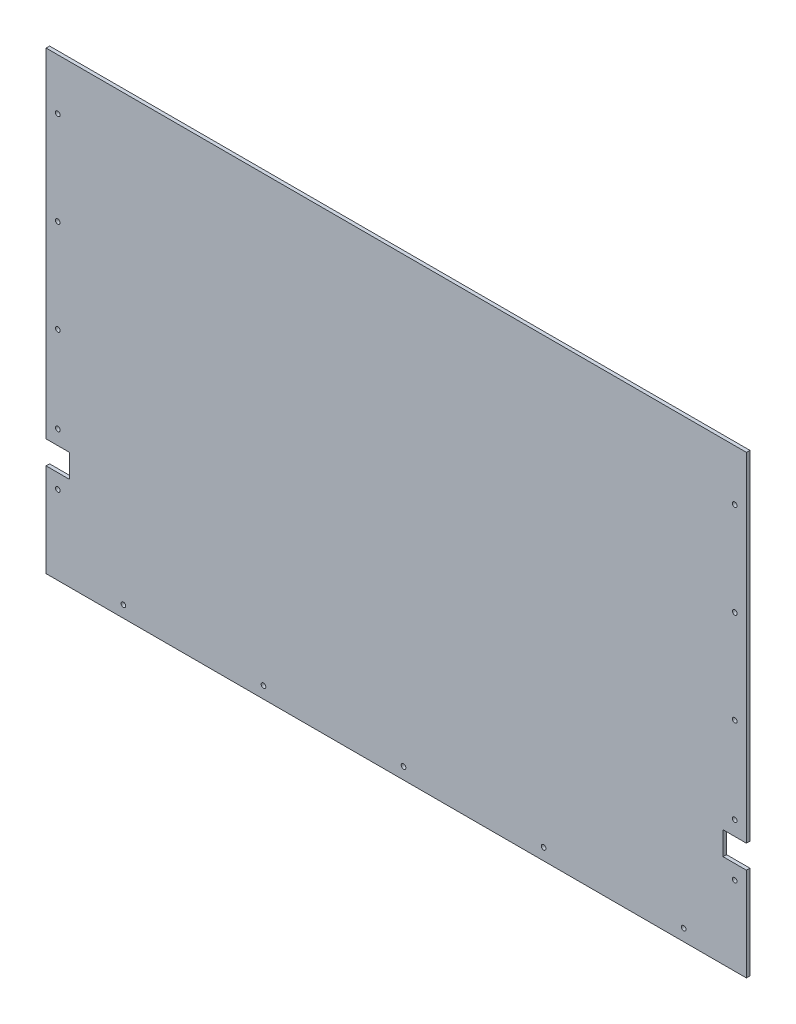
ISO-10303-21;
HEADER;
FILE_DESCRIPTION(('STEP AP214'),'2;1');
FILE_NAME('part.step','',(''),(''),'','','');
FILE_SCHEMA(('AUTOMOTIVE_DESIGN { 1 0 10303 214 1 1 1 1 }'));
ENDSEC;
DATA;
#1=APPLICATION_CONTEXT('core data for automotive mechanical design processes');
#2=APPLICATION_PROTOCOL_DEFINITION('international standard','automotive_design',2000,#1);
#3=PRODUCT_CONTEXT('',#1,'mechanical');
#4=PRODUCT('Part','Part','',(#3));
#5=PRODUCT_RELATED_PRODUCT_CATEGORY('part','',(#4));
#6=PRODUCT_DEFINITION_FORMATION('','',#4);
#7=PRODUCT_DEFINITION_CONTEXT('part definition',#1,'design');
#8=PRODUCT_DEFINITION('design','',#6,#7);
#9=PRODUCT_DEFINITION_SHAPE('','',#8);
#10=(LENGTH_UNIT() NAMED_UNIT(*) SI_UNIT(.MILLI.,.METRE.));
#11=(NAMED_UNIT(*) PLANE_ANGLE_UNIT() SI_UNIT($,.RADIAN.));
#12=(NAMED_UNIT(*) SI_UNIT($,.STERADIAN.) SOLID_ANGLE_UNIT());
#13=UNCERTAINTY_MEASURE_WITH_UNIT(LENGTH_MEASURE(1.E-05),#10,'distance_accuracy_value','');
#14=(GEOMETRIC_REPRESENTATION_CONTEXT(3) GLOBAL_UNCERTAINTY_ASSIGNED_CONTEXT((#13)) GLOBAL_UNIT_ASSIGNED_CONTEXT((#10,
#11,#12)) REPRESENTATION_CONTEXT('',''));
#15=CARTESIAN_POINT('',(0.,0.,0.));
#16=DIRECTION('',(0.,0.,1.));
#17=DIRECTION('',(1.,0.,0.));
#18=AXIS2_PLACEMENT_3D('',#15,#16,#17);
#19=CARTESIAN_POINT('',(0.,0.,3.));
#20=DIRECTION('',(1.,0.,0.));
#21=DIRECTION('',(0.,0.,-1.));
#22=AXIS2_PLACEMENT_3D('',#19,#20,#21);
#23=PLANE('',#22);
#24=DIRECTION('',(0.,-1.,0.));
#25=VECTOR('',#24,1.);
#26=CARTESIAN_POINT('',(0.,0.,0.));
#27=LINE('',#26,#25);
#28=CARTESIAN_POINT('',(0.,390.,0.));
#29=VERTEX_POINT('',#28);
#30=CARTESIAN_POINT('',(0.,100.,0.));
#31=VERTEX_POINT('',#30);
#32=EDGE_CURVE('E153',#29,#31,#27,.T.);
#33=ORIENTED_EDGE('',*,*,#32,.T.);
#34=DIRECTION('',(0.,0.,1.));
#35=VECTOR('',#34,1.);
#36=CARTESIAN_POINT('',(0.,100.,0.));
#37=LINE('',#36,#35);
#38=CARTESIAN_POINT('',(0.,100.,3.));
#39=VERTEX_POINT('',#38);
#40=EDGE_CURVE('E185',#31,#39,#37,.T.);
#41=ORIENTED_EDGE('',*,*,#40,.T.);
#42=DIRECTION('',(0.,-1.,0.));
#43=VECTOR('',#42,1.);
#44=CARTESIAN_POINT('',(0.,0.,3.));
#45=LINE('',#44,#43);
#46=CARTESIAN_POINT('',(0.,390.,3.));
#47=VERTEX_POINT('',#46);
#48=EDGE_CURVE('E219',#47,#39,#45,.T.);
#49=ORIENTED_EDGE('',*,*,#48,.F.);
#50=DIRECTION('',(0.,0.,-1.));
#51=VECTOR('',#50,1.);
#52=CARTESIAN_POINT('',(0.,390.,3.));
#53=LINE('',#52,#51);
#54=EDGE_CURVE('E159',#47,#29,#53,.T.);
#55=ORIENTED_EDGE('',*,*,#54,.T.);
#56=EDGE_LOOP('',(#33,#41,#49,#55));
#57=FACE_BOUND('',#56,.T.);
#58=ADVANCED_FACE('F36',(#57),#23,.F.);
#59=CARTESIAN_POINT('',(600.,0.,3.));
#60=DIRECTION('',(-1.,0.,0.));
#61=DIRECTION('',(0.,0.,1.));
#62=AXIS2_PLACEMENT_3D('',#59,#60,#61);
#63=PLANE('',#62);
#64=DIRECTION('',(0.,1.,0.));
#65=VECTOR('',#64,1.);
#66=CARTESIAN_POINT('',(600.,0.,0.));
#67=LINE('',#66,#65);
#68=CARTESIAN_POINT('',(600.,0.,0.));
#69=VERTEX_POINT('',#68);
#70=CARTESIAN_POINT('',(600.,80.,0.));
#71=VERTEX_POINT('',#70);
#72=EDGE_CURVE('E149',#69,#71,#67,.T.);
#73=ORIENTED_EDGE('',*,*,#72,.T.);
#74=DIRECTION('',(0.,0.,1.));
#75=VECTOR('',#74,1.);
#76=CARTESIAN_POINT('',(600.,80.,0.));
#77=LINE('',#76,#75);
#78=CARTESIAN_POINT('',(600.,80.,3.));
#79=VERTEX_POINT('',#78);
#80=EDGE_CURVE('E189',#71,#79,#77,.T.);
#81=ORIENTED_EDGE('',*,*,#80,.T.);
#82=DIRECTION('',(0.,1.,0.));
#83=VECTOR('',#82,1.);
#84=CARTESIAN_POINT('',(600.,0.,3.));
#85=LINE('',#84,#83);
#86=CARTESIAN_POINT('',(600.,0.,3.));
#87=VERTEX_POINT('',#86);
#88=EDGE_CURVE('E172',#87,#79,#85,.T.);
#89=ORIENTED_EDGE('',*,*,#88,.F.);
#90=DIRECTION('',(0.,0.,-1.));
#91=VECTOR('',#90,1.);
#92=CARTESIAN_POINT('',(600.,0.,3.));
#93=LINE('',#92,#91);
#94=EDGE_CURVE('E44',#87,#69,#93,.T.);
#95=ORIENTED_EDGE('',*,*,#94,.T.);
#96=EDGE_LOOP('',(#73,#81,#89,#95));
#97=FACE_BOUND('',#96,.T.);
#98=ADVANCED_FACE('F169',(#97),#63,.F.);
#99=CARTESIAN_POINT('',(0.,80.,3.));
#100=VERTEX_POINT('',#99);
#101=CARTESIAN_POINT('',(0.,0.,3.));
#102=VERTEX_POINT('',#101);
#103=EDGE_CURVE('E158',#100,#102,#45,.T.);
#104=ORIENTED_EDGE('',*,*,#103,.F.);
#105=DIRECTION('',(0.,0.,1.));
#106=VECTOR('',#105,1.);
#107=CARTESIAN_POINT('',(0.,80.,0.));
#108=LINE('',#107,#106);
#109=CARTESIAN_POINT('',(0.,80.,0.));
#110=VERTEX_POINT('',#109);
#111=EDGE_CURVE('E203',#110,#100,#108,.T.);
#112=ORIENTED_EDGE('',*,*,#111,.F.);
#113=CARTESIAN_POINT('',(0.,0.,0.));
#114=VERTEX_POINT('',#113);
#115=EDGE_CURVE('E191',#110,#114,#27,.T.);
#116=ORIENTED_EDGE('',*,*,#115,.T.);
#117=DIRECTION('',(0.,0.,-1.));
#118=VECTOR('',#117,1.);
#119=CARTESIAN_POINT('',(0.,0.,3.));
#120=LINE('',#119,#118);
#121=EDGE_CURVE('E11',#102,#114,#120,.T.);
#122=ORIENTED_EDGE('',*,*,#121,.F.);
#123=EDGE_LOOP('',(#104,#112,#116,#122));
#124=FACE_BOUND('',#123,.T.);
#125=ADVANCED_FACE('F38',(#124),#23,.F.);
#126=CARTESIAN_POINT('',(0.,0.,3.));
#127=DIRECTION('',(0.,1.,0.));
#128=DIRECTION('',(0.,0.,1.));
#129=AXIS2_PLACEMENT_3D('',#126,#127,#128);
#130=PLANE('',#129);
#131=DIRECTION('',(1.,0.,0.));
#132=VECTOR('',#131,1.);
#133=CARTESIAN_POINT('',(0.,0.,0.));
#134=LINE('',#133,#132);
#135=EDGE_CURVE('E150',#114,#69,#134,.T.);
#136=ORIENTED_EDGE('',*,*,#135,.T.);
#137=ORIENTED_EDGE('',*,*,#94,.F.);
#138=DIRECTION('',(1.,0.,0.));
#139=VECTOR('',#138,1.);
#140=CARTESIAN_POINT('',(0.,0.,3.));
#141=LINE('',#140,#139);
#142=EDGE_CURVE('E222',#102,#87,#141,.T.);
#143=ORIENTED_EDGE('',*,*,#142,.F.);
#144=ORIENTED_EDGE('',*,*,#121,.T.);
#145=EDGE_LOOP('',(#136,#137,#143,#144));
#146=FACE_BOUND('',#145,.T.);
#147=ADVANCED_FACE('F251',(#146),#130,.F.);
#148=CARTESIAN_POINT('',(600.,100.,3.));
#149=VERTEX_POINT('',#148);
#150=CARTESIAN_POINT('',(600.,390.,3.));
#151=VERTEX_POINT('',#150);
#152=EDGE_CURVE('E141',#149,#151,#85,.T.);
#153=ORIENTED_EDGE('',*,*,#152,.F.);
#154=DIRECTION('',(0.,0.,1.));
#155=VECTOR('',#154,1.);
#156=CARTESIAN_POINT('',(600.,100.,0.));
#157=LINE('',#156,#155);
#158=CARTESIAN_POINT('',(600.,100.,0.));
#159=VERTEX_POINT('',#158);
#160=EDGE_CURVE('E128',#159,#149,#157,.T.);
#161=ORIENTED_EDGE('',*,*,#160,.F.);
#162=CARTESIAN_POINT('',(600.,390.,0.));
#163=VERTEX_POINT('',#162);
#164=EDGE_CURVE('E139',#159,#163,#67,.T.);
#165=ORIENTED_EDGE('',*,*,#164,.T.);
#166=DIRECTION('',(0.,0.,-1.));
#167=VECTOR('',#166,1.);
#168=CARTESIAN_POINT('',(600.,390.,3.));
#169=LINE('',#168,#167);
#170=EDGE_CURVE('E162',#151,#163,#169,.T.);
#171=ORIENTED_EDGE('',*,*,#170,.F.);
#172=EDGE_LOOP('',(#153,#161,#165,#171));
#173=FACE_BOUND('',#172,.T.);
#174=ADVANCED_FACE('F137',(#173),#63,.F.);
#175=CARTESIAN_POINT('',(0.,390.,3.));
#176=DIRECTION('',(0.,-1.,0.));
#177=DIRECTION('',(0.,0.,-1.));
#178=AXIS2_PLACEMENT_3D('',#175,#176,#177);
#179=PLANE('',#178);
#180=DIRECTION('',(-1.,0.,0.));
#181=VECTOR('',#180,1.);
#182=CARTESIAN_POINT('',(0.,390.,0.));
#183=LINE('',#182,#181);
#184=EDGE_CURVE('E148',#163,#29,#183,.T.);
#185=ORIENTED_EDGE('',*,*,#184,.T.);
#186=ORIENTED_EDGE('',*,*,#54,.F.);
#187=DIRECTION('',(-1.,0.,0.));
#188=VECTOR('',#187,1.);
#189=CARTESIAN_POINT('',(0.,390.,3.));
#190=LINE('',#189,#188);
#191=EDGE_CURVE('E163',#151,#47,#190,.T.);
#192=ORIENTED_EDGE('',*,*,#191,.F.);
#193=ORIENTED_EDGE('',*,*,#170,.T.);
#194=EDGE_LOOP('',(#185,#186,#192,#193));
#195=FACE_BOUND('',#194,.T.);
#196=ADVANCED_FACE('F246',(#195),#179,.F.);
#197=CARTESIAN_POINT('',(0.,0.,3.));
#198=DIRECTION('',(0.,0.,-1.));
#199=DIRECTION('',(-1.,0.,0.));
#200=AXIS2_PLACEMENT_3D('',#197,#198,#199);
#201=PLANE('',#200);
#202=CARTESIAN_POINT('',(590.,346.25,3.));
#203=DIRECTION('',(0.,0.,-1.));
#204=DIRECTION('',(-1.,0.,0.));
#205=AXIS2_PLACEMENT_3D('',#202,#203,#204);
#206=CIRCLE('',#205,2.);
#207=CARTESIAN_POINT('',(588.,346.25,3.));
#208=VERTEX_POINT('',#207);
#209=EDGE_CURVE('E349',#208,#208,#206,.T.);
#210=ORIENTED_EDGE('',*,*,#209,.T.);
#211=EDGE_LOOP('',(#210));
#212=FACE_BOUND('',#211,.T.);
#213=CARTESIAN_POINT('',(10.,346.25,3.));
#214=DIRECTION('',(0.,0.,-1.));
#215=DIRECTION('',(-1.,0.,0.));
#216=AXIS2_PLACEMENT_3D('',#213,#214,#215);
#217=CIRCLE('',#216,2.);
#218=CARTESIAN_POINT('',(8.00000000000001,346.25,3.));
#219=VERTEX_POINT('',#218);
#220=EDGE_CURVE('E359',#219,#219,#217,.T.);
#221=ORIENTED_EDGE('',*,*,#220,.T.);
#222=EDGE_LOOP('',(#221));
#223=FACE_BOUND('',#222,.T.);
#224=CARTESIAN_POINT('',(9.99999999999912,266.25,3.));
#225=DIRECTION('',(0.,0.,-1.));
#226=DIRECTION('',(-1.,0.,0.));
#227=AXIS2_PLACEMENT_3D('',#224,#225,#226);
#228=CIRCLE('',#227,2.);
#229=CARTESIAN_POINT('',(7.99999999999912,266.25,3.));
#230=VERTEX_POINT('',#229);
#231=EDGE_CURVE('E365',#230,#230,#228,.T.);
#232=ORIENTED_EDGE('',*,*,#231,.T.);
#233=EDGE_LOOP('',(#232));
#234=FACE_BOUND('',#233,.T.);
#235=CARTESIAN_POINT('',(9.99999999999834,186.25,3.));
#236=DIRECTION('',(0.,0.,-1.));
#237=DIRECTION('',(-1.,0.,0.));
#238=AXIS2_PLACEMENT_3D('',#235,#236,#237);
#239=CIRCLE('',#238,2.);
#240=CARTESIAN_POINT('',(7.99999999999835,186.25,3.));
#241=VERTEX_POINT('',#240);
#242=EDGE_CURVE('E371',#241,#241,#239,.T.);
#243=ORIENTED_EDGE('',*,*,#242,.T.);
#244=EDGE_LOOP('',(#243));
#245=FACE_BOUND('',#244,.T.);
#246=CARTESIAN_POINT('',(589.999999999999,266.25,3.));
#247=DIRECTION('',(0.,0.,-1.));
#248=DIRECTION('',(-1.,0.,0.));
#249=AXIS2_PLACEMENT_3D('',#246,#247,#248);
#250=CIRCLE('',#249,2.);
#251=CARTESIAN_POINT('',(587.999999999999,266.25,3.));
#252=VERTEX_POINT('',#251);
#253=EDGE_CURVE('E377',#252,#252,#250,.T.);
#254=ORIENTED_EDGE('',*,*,#253,.T.);
#255=EDGE_LOOP('',(#254));
#256=FACE_BOUND('',#255,.T.);
#257=CARTESIAN_POINT('',(589.999999999998,186.25,3.));
#258=DIRECTION('',(0.,0.,-1.));
#259=DIRECTION('',(-1.,0.,0.));
#260=AXIS2_PLACEMENT_3D('',#257,#258,#259);
#261=CIRCLE('',#260,2.);
#262=CARTESIAN_POINT('',(587.999999999998,186.25,3.));
#263=VERTEX_POINT('',#262);
#264=EDGE_CURVE('E383',#263,#263,#261,.T.);
#265=ORIENTED_EDGE('',*,*,#264,.T.);
#266=EDGE_LOOP('',(#265));
#267=FACE_BOUND('',#266,.T.);
#268=CARTESIAN_POINT('',(589.999999999986,112.449594156221,3.));
#269=DIRECTION('',(0.,0.,-1.));
#270=DIRECTION('',(-1.,0.,0.));
#271=AXIS2_PLACEMENT_3D('',#268,#269,#270);
#272=CIRCLE('',#271,2.);
#273=CARTESIAN_POINT('',(587.999999999986,112.449594156221,3.));
#274=VERTEX_POINT('',#273);
#275=EDGE_CURVE('E389',#274,#274,#272,.T.);
#276=ORIENTED_EDGE('',*,*,#275,.T.);
#277=EDGE_LOOP('',(#276));
#278=FACE_BOUND('',#277,.T.);
#279=CARTESIAN_POINT('',(589.999999999985,67.5504058437759,3.));
#280=DIRECTION('',(0.,0.,-1.));
#281=DIRECTION('',(-1.,0.,0.));
#282=AXIS2_PLACEMENT_3D('',#279,#280,#281);
#283=CIRCLE('',#282,2.);
#284=CARTESIAN_POINT('',(587.999999999985,67.5504058437759,3.));
#285=VERTEX_POINT('',#284);
#286=EDGE_CURVE('E395',#285,#285,#283,.T.);
#287=ORIENTED_EDGE('',*,*,#286,.T.);
#288=EDGE_LOOP('',(#287));
#289=FACE_BOUND('',#288,.T.);
#290=CARTESIAN_POINT('',(9.99999999999631,112.449594156213,3.));
#291=DIRECTION('',(0.,0.,-1.));
#292=DIRECTION('',(-1.,0.,0.));
#293=AXIS2_PLACEMENT_3D('',#290,#291,#292);
#294=CIRCLE('',#293,2.);
#295=CARTESIAN_POINT('',(7.99999999999632,112.449594156213,3.));
#296=VERTEX_POINT('',#295);
#297=EDGE_CURVE('E401',#296,#296,#294,.T.);
#298=ORIENTED_EDGE('',*,*,#297,.T.);
#299=EDGE_LOOP('',(#298));
#300=FACE_BOUND('',#299,.T.);
#301=CARTESIAN_POINT('',(10.0000000000045,67.5504058437766,3.));
#302=DIRECTION('',(0.,0.,-1.));
#303=DIRECTION('',(-1.,0.,0.));
#304=AXIS2_PLACEMENT_3D('',#301,#302,#303);
#305=CIRCLE('',#304,2.);
#306=CARTESIAN_POINT('',(8.00000000000447,67.5504058437766,3.));
#307=VERTEX_POINT('',#306);
#308=EDGE_CURVE('E407',#307,#307,#305,.T.);
#309=ORIENTED_EDGE('',*,*,#308,.T.);
#310=EDGE_LOOP('',(#309));
#311=FACE_BOUND('',#310,.T.);
#312=CARTESIAN_POINT('',(66.250000000002,10.0691053708772,3.));
#313=DIRECTION('',(0.,0.,-1.));
#314=DIRECTION('',(-1.,0.,0.));
#315=AXIS2_PLACEMENT_3D('',#312,#313,#314);
#316=CIRCLE('',#315,2.);
#317=CARTESIAN_POINT('',(64.250000000002,10.0691053708772,3.));
#318=VERTEX_POINT('',#317);
#319=EDGE_CURVE('E413',#318,#318,#316,.T.);
#320=ORIENTED_EDGE('',*,*,#319,.T.);
#321=EDGE_LOOP('',(#320));
#322=FACE_BOUND('',#321,.T.);
#323=CARTESIAN_POINT('',(186.250000000002,10.0691053708773,3.));
#324=DIRECTION('',(0.,0.,-1.));
#325=DIRECTION('',(-1.,0.,0.));
#326=AXIS2_PLACEMENT_3D('',#323,#324,#325);
#327=CIRCLE('',#326,2.);
#328=CARTESIAN_POINT('',(184.250000000002,10.0691053708773,3.));
#329=VERTEX_POINT('',#328);
#330=EDGE_CURVE('E419',#329,#329,#327,.T.);
#331=ORIENTED_EDGE('',*,*,#330,.T.);
#332=EDGE_LOOP('',(#331));
#333=FACE_BOUND('',#332,.T.);
#334=CARTESIAN_POINT('',(306.250000000002,10.0691053708774,3.));
#335=DIRECTION('',(0.,0.,-1.));
#336=DIRECTION('',(-1.,0.,0.));
#337=AXIS2_PLACEMENT_3D('',#334,#335,#336);
#338=CIRCLE('',#337,2.);
#339=CARTESIAN_POINT('',(304.250000000002,10.0691053708774,3.));
#340=VERTEX_POINT('',#339);
#341=EDGE_CURVE('E425',#340,#340,#338,.T.);
#342=ORIENTED_EDGE('',*,*,#341,.T.);
#343=EDGE_LOOP('',(#342));
#344=FACE_BOUND('',#343,.T.);
#345=CARTESIAN_POINT('',(426.250000000002,10.0691053708775,3.));
#346=DIRECTION('',(0.,0.,-1.));
#347=DIRECTION('',(-1.,0.,0.));
#348=AXIS2_PLACEMENT_3D('',#345,#346,#347);
#349=CIRCLE('',#348,2.);
#350=CARTESIAN_POINT('',(424.250000000002,10.0691053708775,3.));
#351=VERTEX_POINT('',#350);
#352=EDGE_CURVE('E431',#351,#351,#349,.T.);
#353=ORIENTED_EDGE('',*,*,#352,.T.);
#354=EDGE_LOOP('',(#353));
#355=FACE_BOUND('',#354,.T.);
#356=CARTESIAN_POINT('',(546.250000000002,10.0691053708775,3.));
#357=DIRECTION('',(0.,0.,-1.));
#358=DIRECTION('',(-1.,0.,0.));
#359=AXIS2_PLACEMENT_3D('',#356,#357,#358);
#360=CIRCLE('',#359,2.);
#361=CARTESIAN_POINT('',(544.250000000002,10.0691053708775,3.));
#362=VERTEX_POINT('',#361);
#363=EDGE_CURVE('E208',#362,#362,#360,.T.);
#364=ORIENTED_EDGE('',*,*,#363,.T.);
#365=EDGE_LOOP('',(#364));
#366=FACE_BOUND('',#365,.T.);
#367=ORIENTED_EDGE('',*,*,#88,.T.);
#368=DIRECTION('',(1.,0.,0.));
#369=VECTOR('',#368,1.);
#370=CARTESIAN_POINT('',(600.,80.,3.));
#371=LINE('',#370,#369);
#372=CARTESIAN_POINT('',(580.,80.,3.));
#373=VERTEX_POINT('',#372);
#374=EDGE_CURVE('E133',#373,#79,#371,.T.);
#375=ORIENTED_EDGE('',*,*,#374,.F.);
#376=DIRECTION('',(0.,-1.,0.));
#377=VECTOR('',#376,1.);
#378=CARTESIAN_POINT('',(580.,100.,3.));
#379=LINE('',#378,#377);
#380=CARTESIAN_POINT('',(580.,100.,3.));
#381=VERTEX_POINT('',#380);
#382=EDGE_CURVE('E184',#381,#373,#379,.T.);
#383=ORIENTED_EDGE('',*,*,#382,.F.);
#384=DIRECTION('',(-1.,0.,0.));
#385=VECTOR('',#384,1.);
#386=CARTESIAN_POINT('',(600.,100.,3.));
#387=LINE('',#386,#385);
#388=EDGE_CURVE('E182',#149,#381,#387,.T.);
#389=ORIENTED_EDGE('',*,*,#388,.F.);
#390=ORIENTED_EDGE('',*,*,#152,.T.);
#391=ORIENTED_EDGE('',*,*,#191,.T.);
#392=ORIENTED_EDGE('',*,*,#48,.T.);
#393=DIRECTION('',(-1.,0.,0.));
#394=VECTOR('',#393,1.);
#395=CARTESIAN_POINT('',(0.,100.,3.));
#396=LINE('',#395,#394);
#397=CARTESIAN_POINT('',(20.,100.,3.));
#398=VERTEX_POINT('',#397);
#399=EDGE_CURVE('E198',#398,#39,#396,.T.);
#400=ORIENTED_EDGE('',*,*,#399,.F.);
#401=DIRECTION('',(0.,1.,0.));
#402=VECTOR('',#401,1.);
#403=CARTESIAN_POINT('',(20.,100.,3.));
#404=LINE('',#403,#402);
#405=CARTESIAN_POINT('',(20.,80.,3.));
#406=VERTEX_POINT('',#405);
#407=EDGE_CURVE('E207',#406,#398,#404,.T.);
#408=ORIENTED_EDGE('',*,*,#407,.F.);
#409=DIRECTION('',(1.,0.,0.));
#410=VECTOR('',#409,1.);
#411=CARTESIAN_POINT('',(0.,80.,3.));
#412=LINE('',#411,#410);
#413=EDGE_CURVE('E204',#100,#406,#412,.T.);
#414=ORIENTED_EDGE('',*,*,#413,.F.);
#415=ORIENTED_EDGE('',*,*,#103,.T.);
#416=ORIENTED_EDGE('',*,*,#142,.T.);
#417=EDGE_LOOP('',(#367,#375,#383,#389,#390,#391,#392,#400,#408,#414,#415,#416));
#418=FACE_BOUND('',#417,.T.);
#419=ADVANCED_FACE('F239',(#212,#223,#234,#245,#256,#267,#278,#289,#300,#311,#322,#333,#344,
#355,#366,#418),#201,.F.);
#420=CARTESIAN_POINT('',(0.,0.,0.));
#421=DIRECTION('',(0.,0.,-1.));
#422=DIRECTION('',(-1.,0.,0.));
#423=AXIS2_PLACEMENT_3D('',#420,#421,#422);
#424=PLANE('',#423);
#425=CARTESIAN_POINT('',(590.,346.25,0.));
#426=DIRECTION('',(0.,0.,-1.));
#427=DIRECTION('',(-1.,0.,0.));
#428=AXIS2_PLACEMENT_3D('',#425,#426,#427);
#429=CIRCLE('',#428,2.);
#430=CARTESIAN_POINT('',(588.,346.25,0.));
#431=VERTEX_POINT('',#430);
#432=EDGE_CURVE('E352',#431,#431,#429,.T.);
#433=ORIENTED_EDGE('',*,*,#432,.F.);
#434=EDGE_LOOP('',(#433));
#435=FACE_BOUND('',#434,.T.);
#436=CARTESIAN_POINT('',(10.,346.25,0.));
#437=DIRECTION('',(0.,0.,-1.));
#438=DIRECTION('',(-1.,0.,0.));
#439=AXIS2_PLACEMENT_3D('',#436,#437,#438);
#440=CIRCLE('',#439,2.);
#441=CARTESIAN_POINT('',(8.00000000000001,346.25,0.));
#442=VERTEX_POINT('',#441);
#443=EDGE_CURVE('E354',#442,#442,#440,.T.);
#444=ORIENTED_EDGE('',*,*,#443,.F.);
#445=EDGE_LOOP('',(#444));
#446=FACE_BOUND('',#445,.T.);
#447=CARTESIAN_POINT('',(9.99999999999912,266.25,0.));
#448=DIRECTION('',(0.,0.,-1.));
#449=DIRECTION('',(-1.,0.,0.));
#450=AXIS2_PLACEMENT_3D('',#447,#448,#449);
#451=CIRCLE('',#450,2.);
#452=CARTESIAN_POINT('',(7.99999999999912,266.25,0.));
#453=VERTEX_POINT('',#452);
#454=EDGE_CURVE('E362',#453,#453,#451,.T.);
#455=ORIENTED_EDGE('',*,*,#454,.F.);
#456=EDGE_LOOP('',(#455));
#457=FACE_BOUND('',#456,.T.);
#458=CARTESIAN_POINT('',(9.99999999999834,186.25,0.));
#459=DIRECTION('',(0.,0.,-1.));
#460=DIRECTION('',(-1.,0.,0.));
#461=AXIS2_PLACEMENT_3D('',#458,#459,#460);
#462=CIRCLE('',#461,2.);
#463=CARTESIAN_POINT('',(7.99999999999834,186.25,0.));
#464=VERTEX_POINT('',#463);
#465=EDGE_CURVE('E368',#464,#464,#462,.T.);
#466=ORIENTED_EDGE('',*,*,#465,.F.);
#467=EDGE_LOOP('',(#466));
#468=FACE_BOUND('',#467,.T.);
#469=CARTESIAN_POINT('',(589.999999999999,266.25,0.));
#470=DIRECTION('',(0.,0.,-1.));
#471=DIRECTION('',(-1.,0.,0.));
#472=AXIS2_PLACEMENT_3D('',#469,#470,#471);
#473=CIRCLE('',#472,2.);
#474=CARTESIAN_POINT('',(587.999999999999,266.25,0.));
#475=VERTEX_POINT('',#474);
#476=EDGE_CURVE('E374',#475,#475,#473,.T.);
#477=ORIENTED_EDGE('',*,*,#476,.F.);
#478=EDGE_LOOP('',(#477));
#479=FACE_BOUND('',#478,.T.);
#480=CARTESIAN_POINT('',(589.999999999998,186.25,0.));
#481=DIRECTION('',(0.,0.,-1.));
#482=DIRECTION('',(-1.,0.,0.));
#483=AXIS2_PLACEMENT_3D('',#480,#481,#482);
#484=CIRCLE('',#483,2.);
#485=CARTESIAN_POINT('',(587.999999999998,186.25,0.));
#486=VERTEX_POINT('',#485);
#487=EDGE_CURVE('E380',#486,#486,#484,.T.);
#488=ORIENTED_EDGE('',*,*,#487,.F.);
#489=EDGE_LOOP('',(#488));
#490=FACE_BOUND('',#489,.T.);
#491=CARTESIAN_POINT('',(589.999999999986,112.449594156221,0.));
#492=DIRECTION('',(0.,0.,-1.));
#493=DIRECTION('',(-1.,0.,0.));
#494=AXIS2_PLACEMENT_3D('',#491,#492,#493);
#495=CIRCLE('',#494,2.);
#496=CARTESIAN_POINT('',(587.999999999986,112.449594156221,0.));
#497=VERTEX_POINT('',#496);
#498=EDGE_CURVE('E386',#497,#497,#495,.T.);
#499=ORIENTED_EDGE('',*,*,#498,.F.);
#500=EDGE_LOOP('',(#499));
#501=FACE_BOUND('',#500,.T.);
#502=CARTESIAN_POINT('',(589.999999999985,67.5504058437759,0.));
#503=DIRECTION('',(0.,0.,-1.));
#504=DIRECTION('',(-1.,0.,0.));
#505=AXIS2_PLACEMENT_3D('',#502,#503,#504);
#506=CIRCLE('',#505,2.);
#507=CARTESIAN_POINT('',(587.999999999985,67.5504058437759,0.));
#508=VERTEX_POINT('',#507);
#509=EDGE_CURVE('E392',#508,#508,#506,.T.);
#510=ORIENTED_EDGE('',*,*,#509,.F.);
#511=EDGE_LOOP('',(#510));
#512=FACE_BOUND('',#511,.T.);
#513=CARTESIAN_POINT('',(9.99999999999631,112.449594156213,0.));
#514=DIRECTION('',(0.,0.,-1.));
#515=DIRECTION('',(-1.,0.,0.));
#516=AXIS2_PLACEMENT_3D('',#513,#514,#515);
#517=CIRCLE('',#516,2.);
#518=CARTESIAN_POINT('',(7.99999999999631,112.449594156213,0.));
#519=VERTEX_POINT('',#518);
#520=EDGE_CURVE('E398',#519,#519,#517,.T.);
#521=ORIENTED_EDGE('',*,*,#520,.F.);
#522=EDGE_LOOP('',(#521));
#523=FACE_BOUND('',#522,.T.);
#524=CARTESIAN_POINT('',(10.0000000000045,67.5504058437766,0.));
#525=DIRECTION('',(0.,0.,-1.));
#526=DIRECTION('',(-1.,0.,0.));
#527=AXIS2_PLACEMENT_3D('',#524,#525,#526);
#528=CIRCLE('',#527,2.);
#529=CARTESIAN_POINT('',(8.00000000000447,67.5504058437766,0.));
#530=VERTEX_POINT('',#529);
#531=EDGE_CURVE('E404',#530,#530,#528,.T.);
#532=ORIENTED_EDGE('',*,*,#531,.F.);
#533=EDGE_LOOP('',(#532));
#534=FACE_BOUND('',#533,.T.);
#535=CARTESIAN_POINT('',(66.250000000002,10.0691053708772,0.));
#536=DIRECTION('',(0.,0.,-1.));
#537=DIRECTION('',(-1.,0.,0.));
#538=AXIS2_PLACEMENT_3D('',#535,#536,#537);
#539=CIRCLE('',#538,2.);
#540=CARTESIAN_POINT('',(64.250000000002,10.0691053708772,0.));
#541=VERTEX_POINT('',#540);
#542=EDGE_CURVE('E410',#541,#541,#539,.T.);
#543=ORIENTED_EDGE('',*,*,#542,.F.);
#544=EDGE_LOOP('',(#543));
#545=FACE_BOUND('',#544,.T.);
#546=CARTESIAN_POINT('',(186.250000000002,10.0691053708773,0.));
#547=DIRECTION('',(0.,0.,-1.));
#548=DIRECTION('',(-1.,0.,0.));
#549=AXIS2_PLACEMENT_3D('',#546,#547,#548);
#550=CIRCLE('',#549,2.);
#551=CARTESIAN_POINT('',(184.250000000002,10.0691053708773,0.));
#552=VERTEX_POINT('',#551);
#553=EDGE_CURVE('E416',#552,#552,#550,.T.);
#554=ORIENTED_EDGE('',*,*,#553,.F.);
#555=EDGE_LOOP('',(#554));
#556=FACE_BOUND('',#555,.T.);
#557=CARTESIAN_POINT('',(306.250000000002,10.0691053708774,0.));
#558=DIRECTION('',(0.,0.,-1.));
#559=DIRECTION('',(-1.,0.,0.));
#560=AXIS2_PLACEMENT_3D('',#557,#558,#559);
#561=CIRCLE('',#560,2.);
#562=CARTESIAN_POINT('',(304.250000000002,10.0691053708774,0.));
#563=VERTEX_POINT('',#562);
#564=EDGE_CURVE('E422',#563,#563,#561,.T.);
#565=ORIENTED_EDGE('',*,*,#564,.F.);
#566=EDGE_LOOP('',(#565));
#567=FACE_BOUND('',#566,.T.);
#568=CARTESIAN_POINT('',(426.250000000002,10.0691053708775,0.));
#569=DIRECTION('',(0.,0.,-1.));
#570=DIRECTION('',(-1.,0.,0.));
#571=AXIS2_PLACEMENT_3D('',#568,#569,#570);
#572=CIRCLE('',#571,2.);
#573=CARTESIAN_POINT('',(424.250000000002,10.0691053708775,0.));
#574=VERTEX_POINT('',#573);
#575=EDGE_CURVE('E428',#574,#574,#572,.T.);
#576=ORIENTED_EDGE('',*,*,#575,.F.);
#577=EDGE_LOOP('',(#576));
#578=FACE_BOUND('',#577,.T.);
#579=CARTESIAN_POINT('',(546.250000000002,10.0691053708775,0.));
#580=DIRECTION('',(0.,0.,-1.));
#581=DIRECTION('',(-1.,0.,0.));
#582=AXIS2_PLACEMENT_3D('',#579,#580,#581);
#583=CIRCLE('',#582,2.);
#584=CARTESIAN_POINT('',(544.250000000002,10.0691053708775,0.));
#585=VERTEX_POINT('',#584);
#586=EDGE_CURVE('E434',#585,#585,#583,.T.);
#587=ORIENTED_EDGE('',*,*,#586,.F.);
#588=EDGE_LOOP('',(#587));
#589=FACE_BOUND('',#588,.T.);
#590=DIRECTION('',(1.,0.,0.));
#591=VECTOR('',#590,1.);
#592=CARTESIAN_POINT('',(600.,80.,0.));
#593=LINE('',#592,#591);
#594=CARTESIAN_POINT('',(580.,80.,0.));
#595=VERTEX_POINT('',#594);
#596=EDGE_CURVE('E142',#595,#71,#593,.T.);
#597=ORIENTED_EDGE('',*,*,#596,.T.);
#598=ORIENTED_EDGE('',*,*,#72,.F.);
#599=ORIENTED_EDGE('',*,*,#135,.F.);
#600=ORIENTED_EDGE('',*,*,#115,.F.);
#601=DIRECTION('',(1.,0.,0.));
#602=VECTOR('',#601,1.);
#603=CARTESIAN_POINT('',(0.,80.,0.));
#604=LINE('',#603,#602);
#605=CARTESIAN_POINT('',(20.,80.,0.));
#606=VERTEX_POINT('',#605);
#607=EDGE_CURVE('E195',#110,#606,#604,.T.);
#608=ORIENTED_EDGE('',*,*,#607,.T.);
#609=DIRECTION('',(0.,1.,0.));
#610=VECTOR('',#609,1.);
#611=CARTESIAN_POINT('',(20.,100.,0.));
#612=LINE('',#611,#610);
#613=CARTESIAN_POINT('',(20.,100.,0.));
#614=VERTEX_POINT('',#613);
#615=EDGE_CURVE('E59',#606,#614,#612,.T.);
#616=ORIENTED_EDGE('',*,*,#615,.T.);
#617=DIRECTION('',(-1.,0.,0.));
#618=VECTOR('',#617,1.);
#619=CARTESIAN_POINT('',(0.,100.,0.));
#620=LINE('',#619,#618);
#621=EDGE_CURVE('E200',#614,#31,#620,.T.);
#622=ORIENTED_EDGE('',*,*,#621,.T.);
#623=ORIENTED_EDGE('',*,*,#32,.F.);
#624=ORIENTED_EDGE('',*,*,#184,.F.);
#625=ORIENTED_EDGE('',*,*,#164,.F.);
#626=DIRECTION('',(-1.,0.,0.));
#627=VECTOR('',#626,1.);
#628=CARTESIAN_POINT('',(600.,100.,0.));
#629=LINE('',#628,#627);
#630=CARTESIAN_POINT('',(580.,100.,0.));
#631=VERTEX_POINT('',#630);
#632=EDGE_CURVE('E124',#159,#631,#629,.T.);
#633=ORIENTED_EDGE('',*,*,#632,.T.);
#634=DIRECTION('',(0.,-1.,0.));
#635=VECTOR('',#634,1.);
#636=CARTESIAN_POINT('',(580.,100.,0.));
#637=LINE('',#636,#635);
#638=EDGE_CURVE('E51',#631,#595,#637,.T.);
#639=ORIENTED_EDGE('',*,*,#638,.T.);
#640=EDGE_LOOP('',(#597,#598,#599,#600,#608,#616,#622,#623,#624,#625,#633,#639));
#641=FACE_BOUND('',#640,.T.);
#642=ADVANCED_FACE('F146',(#435,#446,#457,#468,#479,#490,#501,#512,#523,#534,#545,#556,#567,
#578,#589,#641),#424,.T.);
#643=CARTESIAN_POINT('',(0.,100.,0.));
#644=DIRECTION('',(0.,1.,0.));
#645=DIRECTION('',(0.,0.,1.));
#646=AXIS2_PLACEMENT_3D('',#643,#644,#645);
#647=PLANE('',#646);
#648=ORIENTED_EDGE('',*,*,#399,.T.);
#649=ORIENTED_EDGE('',*,*,#40,.F.);
#650=ORIENTED_EDGE('',*,*,#621,.F.);
#651=DIRECTION('',(0.,0.,1.));
#652=VECTOR('',#651,1.);
#653=CARTESIAN_POINT('',(20.,100.,0.));
#654=LINE('',#653,#652);
#655=EDGE_CURVE('E214',#614,#398,#654,.T.);
#656=ORIENTED_EDGE('',*,*,#655,.T.);
#657=EDGE_LOOP('',(#648,#649,#650,#656));
#658=FACE_BOUND('',#657,.T.);
#659=ADVANCED_FACE('F242',(#658),#647,.F.);
#660=CARTESIAN_POINT('',(20.,100.,0.));
#661=DIRECTION('',(1.,0.,0.));
#662=DIRECTION('',(0.,1.,0.));
#663=AXIS2_PLACEMENT_3D('',#660,#661,#662);
#664=PLANE('',#663);
#665=ORIENTED_EDGE('',*,*,#407,.T.);
#666=ORIENTED_EDGE('',*,*,#655,.F.);
#667=ORIENTED_EDGE('',*,*,#615,.F.);
#668=DIRECTION('',(0.,0.,1.));
#669=VECTOR('',#668,1.);
#670=CARTESIAN_POINT('',(20.,80.,0.));
#671=LINE('',#670,#669);
#672=EDGE_CURVE('E216',#606,#406,#671,.T.);
#673=ORIENTED_EDGE('',*,*,#672,.T.);
#674=EDGE_LOOP('',(#665,#666,#667,#673));
#675=FACE_BOUND('',#674,.T.);
#676=ADVANCED_FACE('F235',(#675),#664,.F.);
#677=CARTESIAN_POINT('',(0.,80.,0.));
#678=DIRECTION('',(0.,-1.,0.));
#679=DIRECTION('',(0.,0.,-1.));
#680=AXIS2_PLACEMENT_3D('',#677,#678,#679);
#681=PLANE('',#680);
#682=ORIENTED_EDGE('',*,*,#413,.T.);
#683=ORIENTED_EDGE('',*,*,#672,.F.);
#684=ORIENTED_EDGE('',*,*,#607,.F.);
#685=ORIENTED_EDGE('',*,*,#111,.T.);
#686=EDGE_LOOP('',(#682,#683,#684,#685));
#687=FACE_BOUND('',#686,.T.);
#688=ADVANCED_FACE('F232',(#687),#681,.F.);
#689=CARTESIAN_POINT('',(600.,80.,0.));
#690=DIRECTION('',(0.,-1.,0.));
#691=DIRECTION('',(0.,0.,-1.));
#692=AXIS2_PLACEMENT_3D('',#689,#690,#691);
#693=PLANE('',#692);
#694=ORIENTED_EDGE('',*,*,#374,.T.);
#695=ORIENTED_EDGE('',*,*,#80,.F.);
#696=ORIENTED_EDGE('',*,*,#596,.F.);
#697=DIRECTION('',(0.,0.,1.));
#698=VECTOR('',#697,1.);
#699=CARTESIAN_POINT('',(580.,80.,0.));
#700=LINE('',#699,#698);
#701=EDGE_CURVE('E192',#595,#373,#700,.T.);
#702=ORIENTED_EDGE('',*,*,#701,.T.);
#703=EDGE_LOOP('',(#694,#695,#696,#702));
#704=FACE_BOUND('',#703,.T.);
#705=ADVANCED_FACE('F250',(#704),#693,.F.);
#706=CARTESIAN_POINT('',(580.,100.,0.));
#707=DIRECTION('',(-1.,0.,0.));
#708=DIRECTION('',(0.,0.,1.));
#709=AXIS2_PLACEMENT_3D('',#706,#707,#708);
#710=PLANE('',#709);
#711=ORIENTED_EDGE('',*,*,#382,.T.);
#712=ORIENTED_EDGE('',*,*,#701,.F.);
#713=ORIENTED_EDGE('',*,*,#638,.F.);
#714=DIRECTION('',(0.,0.,1.));
#715=VECTOR('',#714,1.);
#716=CARTESIAN_POINT('',(580.,100.,0.));
#717=LINE('',#716,#715);
#718=EDGE_CURVE('E130',#631,#381,#717,.T.);
#719=ORIENTED_EDGE('',*,*,#718,.T.);
#720=EDGE_LOOP('',(#711,#712,#713,#719));
#721=FACE_BOUND('',#720,.T.);
#722=ADVANCED_FACE('F249',(#721),#710,.F.);
#723=CARTESIAN_POINT('',(600.,100.,0.));
#724=DIRECTION('',(0.,1.,0.));
#725=DIRECTION('',(-1.,0.,0.));
#726=AXIS2_PLACEMENT_3D('',#723,#724,#725);
#727=PLANE('',#726);
#728=ORIENTED_EDGE('',*,*,#388,.T.);
#729=ORIENTED_EDGE('',*,*,#718,.F.);
#730=ORIENTED_EDGE('',*,*,#632,.F.);
#731=ORIENTED_EDGE('',*,*,#160,.T.);
#732=EDGE_LOOP('',(#728,#729,#730,#731));
#733=FACE_BOUND('',#732,.T.);
#734=ADVANCED_FACE('F127',(#733),#727,.F.);
#735=CARTESIAN_POINT('',(546.250000000002,10.0691053708775,0.));
#736=DIRECTION('',(0.,0.,-1.));
#737=DIRECTION('',(-1.,0.,0.));
#738=AXIS2_PLACEMENT_3D('',#735,#736,#737);
#739=CYLINDRICAL_SURFACE('',#738,2.);
#740=ORIENTED_EDGE('',*,*,#363,.F.);
#741=EDGE_LOOP('',(#740));
#742=FACE_BOUND('',#741,.T.);
#743=ORIENTED_EDGE('',*,*,#586,.T.);
#744=EDGE_LOOP('',(#743));
#745=FACE_BOUND('',#744,.T.);
#746=ADVANCED_FACE('F281',(#742,#745),#739,.F.);
#747=CARTESIAN_POINT('',(426.250000000002,10.0691053708775,0.));
#748=DIRECTION('',(0.,0.,-1.));
#749=DIRECTION('',(-1.,0.,0.));
#750=AXIS2_PLACEMENT_3D('',#747,#748,#749);
#751=CYLINDRICAL_SURFACE('',#750,2.);
#752=ORIENTED_EDGE('',*,*,#352,.F.);
#753=EDGE_LOOP('',(#752));
#754=FACE_BOUND('',#753,.T.);
#755=ORIENTED_EDGE('',*,*,#575,.T.);
#756=EDGE_LOOP('',(#755));
#757=FACE_BOUND('',#756,.T.);
#758=ADVANCED_FACE('F288',(#754,#757),#751,.F.);
#759=CARTESIAN_POINT('',(306.250000000002,10.0691053708774,0.));
#760=DIRECTION('',(0.,0.,-1.));
#761=DIRECTION('',(-1.,0.,0.));
#762=AXIS2_PLACEMENT_3D('',#759,#760,#761);
#763=CYLINDRICAL_SURFACE('',#762,2.);
#764=ORIENTED_EDGE('',*,*,#341,.F.);
#765=EDGE_LOOP('',(#764));
#766=FACE_BOUND('',#765,.T.);
#767=ORIENTED_EDGE('',*,*,#564,.T.);
#768=EDGE_LOOP('',(#767));
#769=FACE_BOUND('',#768,.T.);
#770=ADVANCED_FACE('F292',(#766,#769),#763,.F.);
#771=CARTESIAN_POINT('',(186.250000000002,10.0691053708773,0.));
#772=DIRECTION('',(0.,0.,-1.));
#773=DIRECTION('',(-1.,0.,0.));
#774=AXIS2_PLACEMENT_3D('',#771,#772,#773);
#775=CYLINDRICAL_SURFACE('',#774,2.);
#776=ORIENTED_EDGE('',*,*,#330,.F.);
#777=EDGE_LOOP('',(#776));
#778=FACE_BOUND('',#777,.T.);
#779=ORIENTED_EDGE('',*,*,#553,.T.);
#780=EDGE_LOOP('',(#779));
#781=FACE_BOUND('',#780,.T.);
#782=ADVANCED_FACE('F296',(#778,#781),#775,.F.);
#783=CARTESIAN_POINT('',(66.250000000002,10.0691053708772,0.));
#784=DIRECTION('',(0.,0.,-1.));
#785=DIRECTION('',(-1.,0.,0.));
#786=AXIS2_PLACEMENT_3D('',#783,#784,#785);
#787=CYLINDRICAL_SURFACE('',#786,2.);
#788=ORIENTED_EDGE('',*,*,#319,.F.);
#789=EDGE_LOOP('',(#788));
#790=FACE_BOUND('',#789,.T.);
#791=ORIENTED_EDGE('',*,*,#542,.T.);
#792=EDGE_LOOP('',(#791));
#793=FACE_BOUND('',#792,.T.);
#794=ADVANCED_FACE('F300',(#790,#793),#787,.F.);
#795=CARTESIAN_POINT('',(10.0000000000045,67.5504058437766,0.));
#796=DIRECTION('',(0.,0.,-1.));
#797=DIRECTION('',(-1.,0.,0.));
#798=AXIS2_PLACEMENT_3D('',#795,#796,#797);
#799=CYLINDRICAL_SURFACE('',#798,2.);
#800=ORIENTED_EDGE('',*,*,#308,.F.);
#801=EDGE_LOOP('',(#800));
#802=FACE_BOUND('',#801,.T.);
#803=ORIENTED_EDGE('',*,*,#531,.T.);
#804=EDGE_LOOP('',(#803));
#805=FACE_BOUND('',#804,.T.);
#806=ADVANCED_FACE('F304',(#802,#805),#799,.F.);
#807=CARTESIAN_POINT('',(9.99999999999631,112.449594156213,0.));
#808=DIRECTION('',(0.,0.,-1.));
#809=DIRECTION('',(-1.,0.,0.));
#810=AXIS2_PLACEMENT_3D('',#807,#808,#809);
#811=CYLINDRICAL_SURFACE('',#810,2.);
#812=ORIENTED_EDGE('',*,*,#297,.F.);
#813=EDGE_LOOP('',(#812));
#814=FACE_BOUND('',#813,.T.);
#815=ORIENTED_EDGE('',*,*,#520,.T.);
#816=EDGE_LOOP('',(#815));
#817=FACE_BOUND('',#816,.T.);
#818=ADVANCED_FACE('F308',(#814,#817),#811,.F.);
#819=CARTESIAN_POINT('',(589.999999999985,67.5504058437759,0.));
#820=DIRECTION('',(0.,0.,-1.));
#821=DIRECTION('',(-1.,0.,0.));
#822=AXIS2_PLACEMENT_3D('',#819,#820,#821);
#823=CYLINDRICAL_SURFACE('',#822,2.);
#824=ORIENTED_EDGE('',*,*,#286,.F.);
#825=EDGE_LOOP('',(#824));
#826=FACE_BOUND('',#825,.T.);
#827=ORIENTED_EDGE('',*,*,#509,.T.);
#828=EDGE_LOOP('',(#827));
#829=FACE_BOUND('',#828,.T.);
#830=ADVANCED_FACE('F312',(#826,#829),#823,.F.);
#831=CARTESIAN_POINT('',(589.999999999986,112.449594156221,0.));
#832=DIRECTION('',(0.,0.,-1.));
#833=DIRECTION('',(-1.,0.,0.));
#834=AXIS2_PLACEMENT_3D('',#831,#832,#833);
#835=CYLINDRICAL_SURFACE('',#834,2.);
#836=ORIENTED_EDGE('',*,*,#275,.F.);
#837=EDGE_LOOP('',(#836));
#838=FACE_BOUND('',#837,.T.);
#839=ORIENTED_EDGE('',*,*,#498,.T.);
#840=EDGE_LOOP('',(#839));
#841=FACE_BOUND('',#840,.T.);
#842=ADVANCED_FACE('F316',(#838,#841),#835,.F.);
#843=CARTESIAN_POINT('',(589.999999999998,186.25,0.));
#844=DIRECTION('',(0.,0.,-1.));
#845=DIRECTION('',(-1.,0.,0.));
#846=AXIS2_PLACEMENT_3D('',#843,#844,#845);
#847=CYLINDRICAL_SURFACE('',#846,2.);
#848=ORIENTED_EDGE('',*,*,#264,.F.);
#849=EDGE_LOOP('',(#848));
#850=FACE_BOUND('',#849,.T.);
#851=ORIENTED_EDGE('',*,*,#487,.T.);
#852=EDGE_LOOP('',(#851));
#853=FACE_BOUND('',#852,.T.);
#854=ADVANCED_FACE('F320',(#850,#853),#847,.F.);
#855=CARTESIAN_POINT('',(589.999999999999,266.25,0.));
#856=DIRECTION('',(0.,0.,-1.));
#857=DIRECTION('',(-1.,0.,0.));
#858=AXIS2_PLACEMENT_3D('',#855,#856,#857);
#859=CYLINDRICAL_SURFACE('',#858,2.);
#860=ORIENTED_EDGE('',*,*,#253,.F.);
#861=EDGE_LOOP('',(#860));
#862=FACE_BOUND('',#861,.T.);
#863=ORIENTED_EDGE('',*,*,#476,.T.);
#864=EDGE_LOOP('',(#863));
#865=FACE_BOUND('',#864,.T.);
#866=ADVANCED_FACE('F324',(#862,#865),#859,.F.);
#867=CARTESIAN_POINT('',(9.99999999999834,186.25,0.));
#868=DIRECTION('',(0.,0.,-1.));
#869=DIRECTION('',(-1.,0.,0.));
#870=AXIS2_PLACEMENT_3D('',#867,#868,#869);
#871=CYLINDRICAL_SURFACE('',#870,2.);
#872=ORIENTED_EDGE('',*,*,#242,.F.);
#873=EDGE_LOOP('',(#872));
#874=FACE_BOUND('',#873,.T.);
#875=ORIENTED_EDGE('',*,*,#465,.T.);
#876=EDGE_LOOP('',(#875));
#877=FACE_BOUND('',#876,.T.);
#878=ADVANCED_FACE('F328',(#874,#877),#871,.F.);
#879=CARTESIAN_POINT('',(9.99999999999912,266.25,0.));
#880=DIRECTION('',(0.,0.,-1.));
#881=DIRECTION('',(-1.,0.,0.));
#882=AXIS2_PLACEMENT_3D('',#879,#880,#881);
#883=CYLINDRICAL_SURFACE('',#882,2.);
#884=ORIENTED_EDGE('',*,*,#231,.F.);
#885=EDGE_LOOP('',(#884));
#886=FACE_BOUND('',#885,.T.);
#887=ORIENTED_EDGE('',*,*,#454,.T.);
#888=EDGE_LOOP('',(#887));
#889=FACE_BOUND('',#888,.T.);
#890=ADVANCED_FACE('F332',(#886,#889),#883,.F.);
#891=CARTESIAN_POINT('',(10.,346.25,0.));
#892=DIRECTION('',(0.,0.,-1.));
#893=DIRECTION('',(-1.,0.,0.));
#894=AXIS2_PLACEMENT_3D('',#891,#892,#893);
#895=CYLINDRICAL_SURFACE('',#894,2.);
#896=ORIENTED_EDGE('',*,*,#220,.F.);
#897=EDGE_LOOP('',(#896));
#898=FACE_BOUND('',#897,.T.);
#899=ORIENTED_EDGE('',*,*,#443,.T.);
#900=EDGE_LOOP('',(#899));
#901=FACE_BOUND('',#900,.T.);
#902=ADVANCED_FACE('F336',(#898,#901),#895,.F.);
#903=CARTESIAN_POINT('',(590.,346.25,0.));
#904=DIRECTION('',(0.,0.,-1.));
#905=DIRECTION('',(-1.,0.,0.));
#906=AXIS2_PLACEMENT_3D('',#903,#904,#905);
#907=CYLINDRICAL_SURFACE('',#906,2.);
#908=ORIENTED_EDGE('',*,*,#209,.F.);
#909=EDGE_LOOP('',(#908));
#910=FACE_BOUND('',#909,.T.);
#911=ORIENTED_EDGE('',*,*,#432,.T.);
#912=EDGE_LOOP('',(#911));
#913=FACE_BOUND('',#912,.T.);
#914=ADVANCED_FACE('F340',(#910,#913),#907,.F.);
#915=CLOSED_SHELL('',(#58,#98,#125,#147,#174,#196,#419,#642,#659,#676,#688,#705,#722,#734,#746,
#758,#770,#782,#794,#806,#818,#830,#842,#854,#866,#878,#890,#902,#914));
#916=MANIFOLD_SOLID_BREP('B2',#915);
#917=ADVANCED_BREP_SHAPE_REPRESENTATION('',(#18,#916),#14);
#918=SHAPE_DEFINITION_REPRESENTATION(#9,#917);
ENDSEC;
END-ISO-10303-21;
